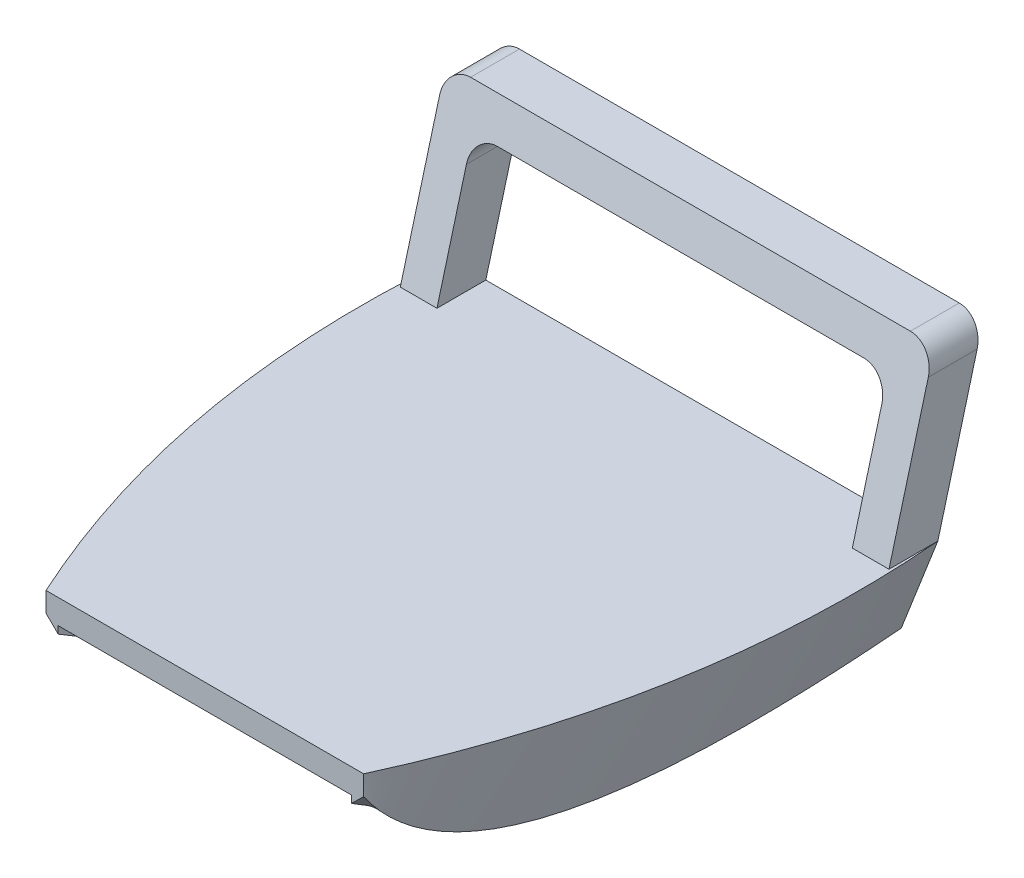
ISO-10303-21;
HEADER;
FILE_DESCRIPTION(('STEP AP214'),'2;1');
FILE_NAME('part.step','',(''),(''),'','','');
FILE_SCHEMA(('AUTOMOTIVE_DESIGN { 1 0 10303 214 1 1 1 1 }'));
ENDSEC;
DATA;
#1=APPLICATION_CONTEXT('core data for automotive mechanical design processes');
#2=APPLICATION_PROTOCOL_DEFINITION('international standard','automotive_design',2000,#1);
#3=PRODUCT_CONTEXT('',#1,'mechanical');
#4=PRODUCT('Part','Part','',(#3));
#5=PRODUCT_RELATED_PRODUCT_CATEGORY('part','',(#4));
#6=PRODUCT_DEFINITION_FORMATION('','',#4);
#7=PRODUCT_DEFINITION_CONTEXT('part definition',#1,'design');
#8=PRODUCT_DEFINITION('design','',#6,#7);
#9=PRODUCT_DEFINITION_SHAPE('','',#8);
#10=(LENGTH_UNIT() NAMED_UNIT(*) SI_UNIT(.MILLI.,.METRE.));
#11=(NAMED_UNIT(*) PLANE_ANGLE_UNIT() SI_UNIT($,.RADIAN.));
#12=(NAMED_UNIT(*) SI_UNIT($,.STERADIAN.) SOLID_ANGLE_UNIT());
#13=UNCERTAINTY_MEASURE_WITH_UNIT(LENGTH_MEASURE(1.E-05),#10,'distance_accuracy_value','');
#14=(GEOMETRIC_REPRESENTATION_CONTEXT(3) GLOBAL_UNCERTAINTY_ASSIGNED_CONTEXT((#13)) GLOBAL_UNIT_ASSIGNED_CONTEXT((#10,
#11,#12)) REPRESENTATION_CONTEXT('',''));
#15=CARTESIAN_POINT('',(0.,0.,0.));
#16=DIRECTION('',(0.,0.,1.));
#17=DIRECTION('',(1.,0.,0.));
#18=AXIS2_PLACEMENT_3D('',#15,#16,#17);
#19=CARTESIAN_POINT('',(1000.,700.,-187.609439102857));
#20=DIRECTION('',(0.,0.258876985011601,0.965910299474699));
#21=DIRECTION('',(0.,-0.965910299474699,0.258876985011601));
#22=AXIS2_PLACEMENT_3D('',#19,#20,#21);
#23=PLANE('',#22);
#24=DIRECTION('',(-1.,0.,0.));
#25=VECTOR('',#24,1.);
#26=CARTESIAN_POINT('',(1000.,700.,-187.609439102857));
#27=LINE('',#26,#25);
#28=CARTESIAN_POINT('',(900.,700.,-187.609439102857));
#29=VERTEX_POINT('',#28);
#30=CARTESIAN_POINT('',(-900.,700.,-187.609439102857));
#31=VERTEX_POINT('',#30);
#32=EDGE_CURVE('E278',#29,#31,#27,.T.);
#33=ORIENTED_EDGE('',*,*,#32,.F.);
#34=CARTESIAN_POINT('',(900.,600.,-160.808090659591));
#35=DIRECTION('',(0.,0.258876985011601,0.965910299474699));
#36=DIRECTION('',(0.,-0.965910299474699,0.258876985011601));
#37=AXIS2_PLACEMENT_3D('',#34,#35,#36);
#38=ELLIPSE('',#37,103.529282226708,100.);
#39=CARTESIAN_POINT('',(1000.,600.,-160.808090659591));
#40=VERTEX_POINT('',#39);
#41=EDGE_CURVE('E666',#29,#40,#38,.F.);
#42=ORIENTED_EDGE('',*,*,#41,.T.);
#43=DIRECTION('',(0.,0.965910299474699,-0.258876985011601));
#44=VECTOR('',#43,1.);
#45=CARTESIAN_POINT('',(1000.,700.,-187.609439102857));
#46=LINE('',#45,#44);
#47=CARTESIAN_POINT('',(1000.,0.,0.));
#48=VERTEX_POINT('',#47);
#49=EDGE_CURVE('E597',#48,#40,#46,.T.);
#50=ORIENTED_EDGE('',*,*,#49,.F.);
#51=DIRECTION('',(-1.,0.,0.));
#52=VECTOR('',#51,1.);
#53=CARTESIAN_POINT('',(0.,0.,0.));
#54=LINE('',#53,#52);
#55=CARTESIAN_POINT('',(850.,0.,0.));
#56=VERTEX_POINT('',#55);
#57=EDGE_CURVE('E424',#48,#56,#54,.T.);
#58=ORIENTED_EDGE('',*,*,#57,.T.);
#59=DIRECTION('',(0.,-0.965910299474699,0.258876985011601));
#60=VECTOR('',#59,1.);
#61=CARTESIAN_POINT('',(850.,700.,-187.609439102857));
#62=LINE('',#61,#60);
#63=CARTESIAN_POINT('',(850.,450.,-120.606067994694));
#64=VERTEX_POINT('',#63);
#65=EDGE_CURVE('E252',#64,#56,#62,.T.);
#66=ORIENTED_EDGE('',*,*,#65,.F.);
#67=CARTESIAN_POINT('',(750.,450.,-120.606067994693));
#68=DIRECTION('',(0.,0.258876985011601,0.965910299474699));
#69=DIRECTION('',(0.,-0.965910299474699,0.258876985011601));
#70=AXIS2_PLACEMENT_3D('',#67,#68,#69);
#71=ELLIPSE('',#70,103.529282226708,100.);
#72=CARTESIAN_POINT('',(750.,550.,-147.407416437959));
#73=VERTEX_POINT('',#72);
#74=EDGE_CURVE('E117',#64,#73,#71,.T.);
#75=ORIENTED_EDGE('',*,*,#74,.T.);
#76=DIRECTION('',(1.,0.,0.));
#77=VECTOR('',#76,1.);
#78=CARTESIAN_POINT('',(1000.,550.,-147.407416437959));
#79=LINE('',#78,#77);
#80=CARTESIAN_POINT('',(-750.,550.,-147.407416437959));
#81=VERTEX_POINT('',#80);
#82=EDGE_CURVE('E651',#81,#73,#79,.T.);
#83=ORIENTED_EDGE('',*,*,#82,.F.);
#84=CARTESIAN_POINT('',(-750.,450.,-120.606067994693));
#85=DIRECTION('',(0.,0.258876985011601,0.965910299474699));
#86=DIRECTION('',(0.,-0.965910299474699,0.258876985011601));
#87=AXIS2_PLACEMENT_3D('',#84,#85,#86);
#88=ELLIPSE('',#87,103.529282226708,100.);
#89=CARTESIAN_POINT('',(-850.,450.,-120.606067994694));
#90=VERTEX_POINT('',#89);
#91=EDGE_CURVE('E131',#81,#90,#88,.T.);
#92=ORIENTED_EDGE('',*,*,#91,.T.);
#93=DIRECTION('',(0.,0.965910299474699,-0.258876985011601));
#94=VECTOR('',#93,1.);
#95=CARTESIAN_POINT('',(-850.,700.,-187.609439102857));
#96=LINE('',#95,#94);
#97=CARTESIAN_POINT('',(-850.,0.,0.));
#98=VERTEX_POINT('',#97);
#99=EDGE_CURVE('E423',#98,#90,#96,.T.);
#100=ORIENTED_EDGE('',*,*,#99,.F.);
#101=DIRECTION('',(1.,0.,0.));
#102=VECTOR('',#101,1.);
#103=CARTESIAN_POINT('',(0.,0.,0.));
#104=LINE('',#103,#102);
#105=CARTESIAN_POINT('',(-1000.,0.,0.));
#106=VERTEX_POINT('',#105);
#107=EDGE_CURVE('E415',#106,#98,#104,.T.);
#108=ORIENTED_EDGE('',*,*,#107,.F.);
#109=DIRECTION('',(0.,0.965910299474699,-0.258876985011601));
#110=VECTOR('',#109,1.);
#111=CARTESIAN_POINT('',(-1000.,700.,-187.609439102857));
#112=LINE('',#111,#110);
#113=CARTESIAN_POINT('',(-1000.,600.,-160.808090659591));
#114=VERTEX_POINT('',#113);
#115=EDGE_CURVE('E629',#106,#114,#112,.T.);
#116=ORIENTED_EDGE('',*,*,#115,.T.);
#117=CARTESIAN_POINT('',(-900.,600.,-160.808090659591));
#118=DIRECTION('',(0.,0.258876985011601,0.965910299474699));
#119=DIRECTION('',(0.,0.965910299474699,-0.258876985011601));
#120=AXIS2_PLACEMENT_3D('',#117,#118,#119);
#121=ELLIPSE('',#120,103.529282226708,100.);
#122=EDGE_CURVE('E664',#114,#31,#121,.F.);
#123=ORIENTED_EDGE('',*,*,#122,.T.);
#124=EDGE_LOOP('',(#33,#42,#50,#58,#66,#75,#83,#92,#100,#108,#116,#123));
#125=FACE_BOUND('',#124,.T.);
#126=ADVANCED_FACE('F109',(#125),#23,.F.);
#127=CARTESIAN_POINT('',(1000.,0.,200.));
#128=DIRECTION('',(0.,-0.258876985011601,-0.965910299474699));
#129=DIRECTION('',(0.,0.965910299474699,-0.258876985011601));
#130=AXIS2_PLACEMENT_3D('',#127,#128,#129);
#131=PLANE('',#130);
#132=DIRECTION('',(0.,-0.965910299474699,0.258876985011601));
#133=VECTOR('',#132,1.);
#134=CARTESIAN_POINT('',(1000.,0.,200.));
#135=LINE('',#134,#133);
#136=CARTESIAN_POINT('',(1000.,600.,39.1919093404087));
#137=VERTEX_POINT('',#136);
#138=CARTESIAN_POINT('',(1000.,0.,200.));
#139=VERTEX_POINT('',#138);
#140=EDGE_CURVE('E281',#137,#139,#135,.T.);
#141=ORIENTED_EDGE('',*,*,#140,.F.);
#142=CARTESIAN_POINT('',(900.,600.,39.1919093404086));
#143=DIRECTION('',(0.,-0.258876985011601,-0.965910299474699));
#144=DIRECTION('',(0.,-0.965910299474699,0.258876985011601));
#145=AXIS2_PLACEMENT_3D('',#142,#143,#144);
#146=ELLIPSE('',#145,103.529282226708,100.);
#147=CARTESIAN_POINT('',(900.,700.,12.3905608971434));
#148=VERTEX_POINT('',#147);
#149=EDGE_CURVE('E710',#137,#148,#146,.F.);
#150=ORIENTED_EDGE('',*,*,#149,.T.);
#151=DIRECTION('',(-1.,0.,0.));
#152=VECTOR('',#151,1.);
#153=CARTESIAN_POINT('',(1000.,700.,12.3905608971434));
#154=LINE('',#153,#152);
#155=CARTESIAN_POINT('',(-900.,700.,12.3905608971434));
#156=VERTEX_POINT('',#155);
#157=EDGE_CURVE('E274',#148,#156,#154,.T.);
#158=ORIENTED_EDGE('',*,*,#157,.T.);
#159=CARTESIAN_POINT('',(-900.,600.,39.1919093404087));
#160=DIRECTION('',(0.,-0.258876985011601,-0.965910299474699));
#161=DIRECTION('',(0.,0.965910299474699,-0.258876985011601));
#162=AXIS2_PLACEMENT_3D('',#159,#160,#161);
#163=ELLIPSE('',#162,103.529282226708,100.);
#164=CARTESIAN_POINT('',(-1000.,600.,39.1919093404087));
#165=VERTEX_POINT('',#164);
#166=EDGE_CURVE('E712',#156,#165,#163,.F.);
#167=ORIENTED_EDGE('',*,*,#166,.T.);
#168=DIRECTION('',(0.,-0.965910299474699,0.258876985011601));
#169=VECTOR('',#168,1.);
#170=CARTESIAN_POINT('',(-1000.,0.,200.));
#171=LINE('',#170,#169);
#172=CARTESIAN_POINT('',(-1000.,0.,200.));
#173=VERTEX_POINT('',#172);
#174=EDGE_CURVE('E283',#165,#173,#171,.T.);
#175=ORIENTED_EDGE('',*,*,#174,.T.);
#176=DIRECTION('',(-1.,0.,0.));
#177=VECTOR('',#176,1.);
#178=CARTESIAN_POINT('',(1000.,0.,200.));
#179=LINE('',#178,#177);
#180=CARTESIAN_POINT('',(-850.,0.,200.));
#181=VERTEX_POINT('',#180);
#182=EDGE_CURVE('E275',#181,#173,#179,.T.);
#183=ORIENTED_EDGE('',*,*,#182,.F.);
#184=DIRECTION('',(0.,-0.965910299474699,0.258876985011601));
#185=VECTOR('',#184,1.);
#186=CARTESIAN_POINT('',(-850.,0.,200.));
#187=LINE('',#186,#185);
#188=CARTESIAN_POINT('',(-850.,450.,79.3939320053065));
#189=VERTEX_POINT('',#188);
#190=EDGE_CURVE('E266',#189,#181,#187,.T.);
#191=ORIENTED_EDGE('',*,*,#190,.F.);
#192=CARTESIAN_POINT('',(-750.,450.,79.3939320053065));
#193=DIRECTION('',(0.,-0.258876985011601,-0.965910299474699));
#194=DIRECTION('',(0.,-0.965910299474699,0.258876985011601));
#195=AXIS2_PLACEMENT_3D('',#192,#193,#194);
#196=ELLIPSE('',#195,103.529282226708,100.);
#197=CARTESIAN_POINT('',(-750.,550.,52.5925835620413));
#198=VERTEX_POINT('',#197);
#199=EDGE_CURVE('E679',#189,#198,#196,.T.);
#200=ORIENTED_EDGE('',*,*,#199,.T.);
#201=DIRECTION('',(-1.,0.,0.));
#202=VECTOR('',#201,1.);
#203=CARTESIAN_POINT('',(1000.,550.,52.5925835620413));
#204=LINE('',#203,#202);
#205=CARTESIAN_POINT('',(750.,550.,52.5925835620413));
#206=VERTEX_POINT('',#205);
#207=EDGE_CURVE('E267',#206,#198,#204,.T.);
#208=ORIENTED_EDGE('',*,*,#207,.F.);
#209=CARTESIAN_POINT('',(750.,450.,79.3939320053065));
#210=DIRECTION('',(0.,-0.258876985011601,-0.965910299474699));
#211=DIRECTION('',(0.,-0.965910299474699,0.258876985011601));
#212=AXIS2_PLACEMENT_3D('',#209,#210,#211);
#213=ELLIPSE('',#212,103.529282226708,100.);
#214=CARTESIAN_POINT('',(850.,450.,79.3939320053065));
#215=VERTEX_POINT('',#214);
#216=EDGE_CURVE('E13',#206,#215,#213,.T.);
#217=ORIENTED_EDGE('',*,*,#216,.T.);
#218=DIRECTION('',(0.,0.965910299474699,-0.258876985011601));
#219=VECTOR('',#218,1.);
#220=CARTESIAN_POINT('',(850.,0.,200.));
#221=LINE('',#220,#219);
#222=CARTESIAN_POINT('',(850.,0.,200.));
#223=VERTEX_POINT('',#222);
#224=EDGE_CURVE('E250',#223,#215,#221,.T.);
#225=ORIENTED_EDGE('',*,*,#224,.F.);
#226=EDGE_CURVE('E262',#139,#223,#179,.T.);
#227=ORIENTED_EDGE('',*,*,#226,.F.);
#228=EDGE_LOOP('',(#141,#150,#158,#167,#175,#183,#191,#200,#208,#217,#225,#227));
#229=FACE_BOUND('',#228,.T.);
#230=ADVANCED_FACE('F261',(#229),#131,.F.);
#231=CARTESIAN_POINT('',(956.26787772273,0.,1021.52801923705));
#232=DIRECTION('',(0.,1.,0.));
#233=DIRECTION('',(0.,0.,1.));
#234=AXIS2_PLACEMENT_3D('',#231,#232,#233);
#235=PLANE('',#234);
#236=DIRECTION('',(0.,0.,-1.));
#237=VECTOR('',#236,1.);
#238=CARTESIAN_POINT('',(-850.,0.,2000.05));
#239=LINE('',#238,#237);
#240=EDGE_CURVE('E256',#181,#98,#239,.T.);
#241=ORIENTED_EDGE('',*,*,#240,.F.);
#242=ORIENTED_EDGE('',*,*,#182,.T.);
#243=DIRECTION('',(0.,0.,-1.));
#244=VECTOR('',#243,1.);
#245=CARTESIAN_POINT('',(-1000.,0.,0.));
#246=LINE('',#245,#244);
#247=EDGE_CURVE('E636',#173,#106,#246,.T.);
#248=ORIENTED_EDGE('',*,*,#247,.T.);
#249=CARTESIAN_POINT('',(-650.000000000001,-9.9513098510631E-12,2000.));
#250=CARTESIAN_POINT('',(-941.690503630308,-1.4417006131429E-11,1362.03735898273));
#251=CARTESIAN_POINT('',(-1058.35717029697,-1.62031386687993E-11,695.370692316063));
#252=CARTESIAN_POINT('',(-1000.,-1.5087662858249E-11,-5.13660575880198E-13));
#253=B_SPLINE_CURVE_WITH_KNOTS('',3,(#249,#250,#251,#252),.UNSPECIFIED.,.F.,.F.,(4,4),(0.,1.),.UNSPECIFIED.);
#254=CARTESIAN_POINT('',(-650.000000000001,-9.9513098510631E-12,2000.));
#255=VERTEX_POINT('',#254);
#256=EDGE_CURVE('E519',#106,#255,#253,.F.);
#257=ORIENTED_EDGE('',*,*,#256,.T.);
#258=DIRECTION('',(-1.,0.,0.));
#259=VECTOR('',#258,1.);
#260=CARTESIAN_POINT('',(0.,0.,2000.));
#261=LINE('',#260,#259);
#262=CARTESIAN_POINT('',(650.,0.,2000.));
#263=VERTEX_POINT('',#262);
#264=EDGE_CURVE('E419',#263,#255,#261,.T.);
#265=ORIENTED_EDGE('',*,*,#264,.F.);
#266=CARTESIAN_POINT('',(1000.,2.22044604925031E-13,0.));
#267=CARTESIAN_POINT('',(1058.35717029697,0.,695.370692316063));
#268=CARTESIAN_POINT('',(941.690503630307,0.,1362.03735898273));
#269=CARTESIAN_POINT('',(650.,0.,2000.));
#270=B_SPLINE_CURVE_WITH_KNOTS('',3,(#266,#267,#268,#269),.UNSPECIFIED.,.F.,.F.,(4,4),(0.,1.),.UNSPECIFIED.);
#271=EDGE_CURVE('E785',#48,#263,#270,.T.);
#272=ORIENTED_EDGE('',*,*,#271,.F.);
#273=DIRECTION('',(0.,0.,-1.));
#274=VECTOR('',#273,1.);
#275=CARTESIAN_POINT('',(1000.,0.,0.));
#276=LINE('',#275,#274);
#277=EDGE_CURVE('E273',#139,#48,#276,.T.);
#278=ORIENTED_EDGE('',*,*,#277,.F.);
#279=ORIENTED_EDGE('',*,*,#226,.T.);
#280=DIRECTION('',(0.,0.,-1.));
#281=VECTOR('',#280,1.);
#282=CARTESIAN_POINT('',(850.,0.,2000.05));
#283=LINE('',#282,#281);
#284=EDGE_CURVE('E246',#223,#56,#283,.T.);
#285=ORIENTED_EDGE('',*,*,#284,.T.);
#286=EDGE_CURVE('E420',#56,#98,#54,.T.);
#287=ORIENTED_EDGE('',*,*,#286,.T.);
#288=EDGE_LOOP('',(#241,#242,#248,#257,#265,#272,#278,#279,#285,#287));
#289=FACE_BOUND('',#288,.T.);
#290=ADVANCED_FACE('F270',(#289),#235,.T.);
#291=CARTESIAN_POINT('',(0.,0.,2000.));
#292=DIRECTION('',(0.,0.,-1.));
#293=DIRECTION('',(-1.,0.,0.));
#294=AXIS2_PLACEMENT_3D('',#291,#292,#293);
#295=PLANE('',#294);
#296=ORIENTED_EDGE('',*,*,#264,.T.);
#297=DIRECTION('',(0.,1.,0.));
#298=VECTOR('',#297,1.);
#299=CARTESIAN_POINT('',(-650.000000000001,-9.9513098510631E-12,2000.));
#300=LINE('',#299,#298);
#301=CARTESIAN_POINT('',(-650.,-81.0102051443464,2000.));
#302=VERTEX_POINT('',#301);
#303=EDGE_CURVE('E288',#302,#255,#300,.T.);
#304=ORIENTED_EDGE('',*,*,#303,.F.);
#305=DIRECTION('',(-0.714285714285726,0.699854212223754,0.));
#306=VECTOR('',#305,1.);
#307=CARTESIAN_POINT('',(-650.,-81.0102051443464,2000.));
#308=LINE('',#307,#306);
#309=CARTESIAN_POINT('',(-599.999999999999,-130.000000000009,2000.));
#310=VERTEX_POINT('',#309);
#311=EDGE_CURVE('E827',#310,#302,#308,.T.);
#312=ORIENTED_EDGE('',*,*,#311,.F.);
#313=DIRECTION('',(0.,-1.,0.));
#314=VECTOR('',#313,1.);
#315=CARTESIAN_POINT('',(-599.999999999999,-130.000000000009,2000.));
#316=LINE('',#315,#314);
#317=CARTESIAN_POINT('',(-599.999999999999,-100.000000000009,2000.));
#318=VERTEX_POINT('',#317);
#319=EDGE_CURVE('E829',#318,#310,#316,.T.);
#320=ORIENTED_EDGE('',*,*,#319,.F.);
#321=DIRECTION('',(-1.,0.,0.));
#322=VECTOR('',#321,1.);
#323=CARTESIAN_POINT('',(-599.999999999999,-100.000000000009,2000.));
#324=LINE('',#323,#322);
#325=CARTESIAN_POINT('',(0.,-100.,2000.));
#326=VERTEX_POINT('',#325);
#327=EDGE_CURVE('E355',#326,#318,#324,.T.);
#328=ORIENTED_EDGE('',*,*,#327,.F.);
#329=DIRECTION('',(1.,0.,0.));
#330=VECTOR('',#329,1.);
#331=CARTESIAN_POINT('',(600.,-99.9999999999999,2000.));
#332=LINE('',#331,#330);
#333=CARTESIAN_POINT('',(600.,-99.9999999999999,2000.));
#334=VERTEX_POINT('',#333);
#335=EDGE_CURVE('E847',#326,#334,#332,.T.);
#336=ORIENTED_EDGE('',*,*,#335,.T.);
#337=DIRECTION('',(0.,-1.,0.));
#338=VECTOR('',#337,1.);
#339=CARTESIAN_POINT('',(600.,-130.,2000.));
#340=LINE('',#339,#338);
#341=CARTESIAN_POINT('',(600.,-130.,2000.));
#342=VERTEX_POINT('',#341);
#343=EDGE_CURVE('E849',#334,#342,#340,.T.);
#344=ORIENTED_EDGE('',*,*,#343,.T.);
#345=DIRECTION('',(0.714285714285715,0.699854212223765,0.));
#346=VECTOR('',#345,1.);
#347=CARTESIAN_POINT('',(650.,-81.0102051443364,2000.));
#348=LINE('',#347,#346);
#349=CARTESIAN_POINT('',(650.,-81.0102051443364,2000.));
#350=VERTEX_POINT('',#349);
#351=EDGE_CURVE('E863',#342,#350,#348,.T.);
#352=ORIENTED_EDGE('',*,*,#351,.T.);
#353=DIRECTION('',(0.,1.,0.));
#354=VECTOR('',#353,1.);
#355=CARTESIAN_POINT('',(650.,0.,2000.));
#356=LINE('',#355,#354);
#357=EDGE_CURVE('E989',#350,#263,#356,.T.);
#358=ORIENTED_EDGE('',*,*,#357,.T.);
#359=EDGE_LOOP('',(#296,#304,#312,#320,#328,#336,#344,#352,#358));
#360=FACE_BOUND('',#359,.T.);
#361=ADVANCED_FACE('F454',(#360),#295,.F.);
#362=CARTESIAN_POINT('',(0.,0.,0.));
#363=DIRECTION('',(0.,0.,1.));
#364=DIRECTION('',(1.,0.,0.));
#365=AXIS2_PLACEMENT_3D('',#362,#363,#364);
#366=PLANE('',#365);
#367=DIRECTION('',(1.,0.,0.));
#368=VECTOR('',#367,1.);
#369=CARTESIAN_POINT('',(0.,-400.,0.));
#370=LINE('',#369,#368);
#371=CARTESIAN_POINT('',(6.0748971133037E-12,-400.,0.));
#372=VERTEX_POINT('',#371);
#373=CARTESIAN_POINT('',(600.,-400.,0.));
#374=VERTEX_POINT('',#373);
#375=EDGE_CURVE('E776',#372,#374,#370,.T.);
#376=ORIENTED_EDGE('',*,*,#375,.F.);
#377=DIRECTION('',(-1.,0.,0.));
#378=VECTOR('',#377,1.);
#379=CARTESIAN_POINT('',(6.0748971133037E-12,-400.,0.));
#380=LINE('',#379,#378);
#381=CARTESIAN_POINT('',(-599.999999999994,-400.000000000009,-3.08196345528117E-13));
#382=VERTEX_POINT('',#381);
#383=EDGE_CURVE('E778',#372,#382,#380,.T.);
#384=ORIENTED_EDGE('',*,*,#383,.T.);
#385=DIRECTION('',(0.,-1.,0.));
#386=VECTOR('',#385,1.);
#387=CARTESIAN_POINT('',(-599.999999999994,-400.000000000009,-3.08196345528117E-13));
#388=LINE('',#387,#386);
#389=CARTESIAN_POINT('',(-599.999999999991,-550.000000000009,-3.08196345528116E-13));
#390=VERTEX_POINT('',#389);
#391=EDGE_CURVE('E792',#382,#390,#388,.T.);
#392=ORIENTED_EDGE('',*,*,#391,.T.);
#393=DIRECTION('',(-0.833333333333342,0.552770798392553,0.));
#394=VECTOR('',#393,1.);
#395=CARTESIAN_POINT('',(-599.999999999991,-550.000000000009,-3.08196345528116E-13));
#396=LINE('',#395,#394);
#397=CARTESIAN_POINT('',(-849.999999999994,-384.168760482243,-4.36611489498167E-13));
#398=VERTEX_POINT('',#397);
#399=EDGE_CURVE('E342',#390,#398,#396,.T.);
#400=ORIENTED_EDGE('',*,*,#399,.T.);
#401=DIRECTION('',(-0.363711840205884,0.931511512163994,0.));
#402=VECTOR('',#401,1.);
#403=CARTESIAN_POINT('',(-849.999999999994,-384.168760482243,-4.36611489498167E-13));
#404=LINE('',#403,#402);
#405=EDGE_CURVE('E368',#398,#106,#404,.T.);
#406=ORIENTED_EDGE('',*,*,#405,.T.);
#407=ORIENTED_EDGE('',*,*,#107,.T.);
#408=ORIENTED_EDGE('',*,*,#286,.F.);
#409=ORIENTED_EDGE('',*,*,#57,.F.);
#410=DIRECTION('',(0.363711840205869,0.931511512163999,0.));
#411=VECTOR('',#410,1.);
#412=CARTESIAN_POINT('',(850.,-384.16876048223,0.));
#413=LINE('',#412,#411);
#414=CARTESIAN_POINT('',(850.,-384.16876048223,0.));
#415=VERTEX_POINT('',#414);
#416=EDGE_CURVE('E610',#415,#48,#413,.T.);
#417=ORIENTED_EDGE('',*,*,#416,.F.);
#418=DIRECTION('',(0.833333333333334,0.552770798392566,0.));
#419=VECTOR('',#418,1.);
#420=CARTESIAN_POINT('',(600.,-550.,0.));
#421=LINE('',#420,#419);
#422=CARTESIAN_POINT('',(600.,-550.,0.));
#423=VERTEX_POINT('',#422);
#424=EDGE_CURVE('E612',#423,#415,#421,.T.);
#425=ORIENTED_EDGE('',*,*,#424,.F.);
#426=DIRECTION('',(0.,-1.,0.));
#427=VECTOR('',#426,1.);
#428=CARTESIAN_POINT('',(600.,-400.,0.));
#429=LINE('',#428,#427);
#430=EDGE_CURVE('E780',#374,#423,#429,.T.);
#431=ORIENTED_EDGE('',*,*,#430,.F.);
#432=EDGE_LOOP('',(#376,#384,#392,#400,#406,#407,#408,#409,#417,#425,#431));
#433=FACE_BOUND('',#432,.T.);
#434=ADVANCED_FACE('F444',(#433),#366,.F.);
#435=CARTESIAN_POINT('',(850.,-384.16876048223,0.));
#436=CARTESIAN_POINT('',(980.339016832515,-309.012688308536,816.014591568673));
#437=CARTESIAN_POINT('',(697.409129067556,-620.180744747319,1639.14845815006));
#438=CARTESIAN_POINT('',(650.,-81.0102051443364,2000.));
#439=CARTESIAN_POINT('',(900.,-256.112506988153,0.));
#440=CARTESIAN_POINT('',(1006.34506798733,-206.008458872358,775.79995848447));
#441=CARTESIAN_POINT('',(778.836253921806,-413.453829831546,1546.77809176095));
#442=CARTESIAN_POINT('',(650.,-54.0068034295576,2000.));
#443=CARTESIAN_POINT('',(950.,-128.056253494077,0.));
#444=CARTESIAN_POINT('',(1032.35111914215,-103.004229436179,735.585325400266));
#445=CARTESIAN_POINT('',(860.263378776057,-206.726914915773,1454.40772537184));
#446=CARTESIAN_POINT('',(650.,-27.0034017147788,2000.));
#447=CARTESIAN_POINT('',(1000.,2.22044604925031E-13,0.));
#448=CARTESIAN_POINT('',(1058.35717029697,0.,695.370692316063));
#449=CARTESIAN_POINT('',(941.690503630307,0.,1362.03735898273));
#450=CARTESIAN_POINT('',(650.,0.,2000.));
#451=B_SPLINE_SURFACE_WITH_KNOTS('',3,3,((#435,#436,#437,#438),(#439,#440,#441,#442),(#443,#444,
#445,#446),(#447,#448,#449,#450)),.UNSPECIFIED.,.F.,.F.,.F.,(4,4),(4,4),(0.,1.),(0.,1.),.UNSPECIFIED.);
#452=CARTESIAN_POINT('',(850.,-384.16876048223,0.));
#453=CARTESIAN_POINT('',(980.339016832515,-309.012688308536,816.014591568673));
#454=CARTESIAN_POINT('',(697.409129067556,-620.180744747319,1639.14845815006));
#455=CARTESIAN_POINT('',(650.,-81.0102051443364,2000.));
#456=B_SPLINE_CURVE_WITH_KNOTS('',3,(#452,#453,#454,#455),.UNSPECIFIED.,.F.,.F.,(4,4),(0.,1.),.UNSPECIFIED.);
#457=EDGE_CURVE('E848',#415,#350,#456,.T.);
#458=ORIENTED_EDGE('',*,*,#416,.T.);
#459=ORIENTED_EDGE('',*,*,#271,.T.);
#460=ORIENTED_EDGE('',*,*,#357,.F.);
#461=ORIENTED_EDGE('',*,*,#457,.F.);
#462=EDGE_LOOP('',(#458,#459,#460,#461));
#463=FACE_BOUND('',#462,.T.);
#464=ADVANCED_FACE('F453',(#463),#451,.T.);
#465=CARTESIAN_POINT('',(0.,-400.,0.));
#466=CARTESIAN_POINT('',(-3.62513666241704E-13,-367.021070822676,619.283108727068));
#467=CARTESIAN_POINT('',(6.67966331851414E-13,-529.66556137813,1454.61989504646));
#468=CARTESIAN_POINT('',(0.,-100.,2000.));
#469=CARTESIAN_POINT('',(200.,-400.,0.));
#470=CARTESIAN_POINT('',(200.,-367.021070822676,619.283108727068));
#471=CARTESIAN_POINT('',(200.000000000001,-529.66556137813,1454.61989504646));
#472=CARTESIAN_POINT('',(200.,-100.,2000.));
#473=CARTESIAN_POINT('',(400.,-400.,0.));
#474=CARTESIAN_POINT('',(400.,-367.021070822675,619.283108727068));
#475=CARTESIAN_POINT('',(400.,-529.66556137813,1454.61989504646));
#476=CARTESIAN_POINT('',(400.,-100.,2000.));
#477=CARTESIAN_POINT('',(600.,-400.,0.));
#478=CARTESIAN_POINT('',(600.,-367.021070822675,619.283108727067));
#479=CARTESIAN_POINT('',(600.,-529.66556137813,1454.61989504646));
#480=CARTESIAN_POINT('',(600.,-99.9999999999999,2000.));
#481=B_SPLINE_SURFACE_WITH_KNOTS('',3,3,((#465,#466,#467,#468),(#469,#470,#471,#472),(#473,#474,
#475,#476),(#477,#478,#479,#480)),.UNSPECIFIED.,.F.,.F.,.F.,(4,4),(4,4),(0.,1.),(0.,1.),.UNSPECIFIED.);
#482=CARTESIAN_POINT('',(600.,-400.,0.));
#483=CARTESIAN_POINT('',(600.,-367.021070822675,619.283108727067));
#484=CARTESIAN_POINT('',(600.,-529.66556137813,1454.61989504646));
#485=CARTESIAN_POINT('',(600.,-99.9999999999999,2000.));
#486=B_SPLINE_CURVE_WITH_KNOTS('',3,(#482,#483,#484,#485),.UNSPECIFIED.,.F.,.F.,(4,4),(0.,1.),.UNSPECIFIED.);
#487=EDGE_CURVE('E858',#374,#334,#486,.T.);
#488=CARTESIAN_POINT('',(0.,-100.,2000.));
#489=CARTESIAN_POINT('',(6.67966331851414E-13,-529.66556137813,1454.61989504646));
#490=CARTESIAN_POINT('',(-3.62513666241704E-13,-367.021070822676,619.283108727068));
#491=CARTESIAN_POINT('',(0.,-400.,0.));
#492=B_SPLINE_CURVE_WITH_KNOTS('',3,(#488,#489,#490,#491),.UNSPECIFIED.,.F.,.F.,(4,4),(0.,1.),.UNSPECIFIED.);
#493=EDGE_CURVE('E790',#326,#372,#492,.T.);
#494=ORIENTED_EDGE('',*,*,#375,.T.);
#495=ORIENTED_EDGE('',*,*,#487,.T.);
#496=ORIENTED_EDGE('',*,*,#335,.F.);
#497=ORIENTED_EDGE('',*,*,#493,.T.);
#498=EDGE_LOOP('',(#494,#495,#496,#497));
#499=FACE_BOUND('',#498,.T.);
#500=ADVANCED_FACE('F868',(#499),#481,.T.);
#501=CARTESIAN_POINT('',(600.,-520.003469305222,1040.81689833622));
#502=DIRECTION('',(1.,0.,0.));
#503=DIRECTION('',(0.,1.,0.));
#504=AXIS2_PLACEMENT_3D('',#501,#502,#503);
#505=PLANE('',#504);
#506=CARTESIAN_POINT('',(600.,-130.,2000.));
#507=CARTESIAN_POINT('',(600.,-510.004625740297,1387.75586444829));
#508=CARTESIAN_POINT('',(600.,-650.004625740297,721.089197781621));
#509=CARTESIAN_POINT('',(600.,-550.,0.));
#510=B_SPLINE_CURVE_WITH_KNOTS('',3,(#506,#507,#508,#509),.UNSPECIFIED.,.F.,.F.,(4,4),(0.,1.),.UNSPECIFIED.);
#511=EDGE_CURVE('E861',#342,#423,#510,.T.);
#512=ORIENTED_EDGE('',*,*,#511,.F.);
#513=ORIENTED_EDGE('',*,*,#343,.F.);
#514=ORIENTED_EDGE('',*,*,#487,.F.);
#515=ORIENTED_EDGE('',*,*,#430,.T.);
#516=EDGE_LOOP('',(#512,#513,#514,#515));
#517=FACE_BOUND('',#516,.T.);
#518=ADVANCED_FACE('F857',(#517),#505,.F.);
#519=CARTESIAN_POINT('',(600.,-550.,0.));
#520=CARTESIAN_POINT('',(600.,-650.004625740297,721.089197781621));
#521=CARTESIAN_POINT('',(600.,-510.004625740297,1387.75586444829));
#522=CARTESIAN_POINT('',(600.,-130.,2000.));
#523=CARTESIAN_POINT('',(683.333333333333,-494.722920160743,0.));
#524=CARTESIAN_POINT('',(726.779672277505,-536.340646596377,752.730995710638));
#525=CARTESIAN_POINT('',(632.469709689185,-546.729998742637,1471.55339568221));
#526=CARTESIAN_POINT('',(616.666666666667,-113.670068381445,2000.));
#527=CARTESIAN_POINT('',(766.666666666667,-439.445840321487,0.));
#528=CARTESIAN_POINT('',(853.55934455501,-422.676667452457,784.372793639656));
#529=CARTESIAN_POINT('',(664.93941937837,-583.455371744978,1555.35092691614));
#530=CARTESIAN_POINT('',(633.333333333333,-97.3401367628909,2000.));
#531=CARTESIAN_POINT('',(850.,-384.16876048223,0.));
#532=CARTESIAN_POINT('',(980.339016832515,-309.012688308536,816.014591568673));
#533=CARTESIAN_POINT('',(697.409129067556,-620.180744747319,1639.14845815006));
#534=CARTESIAN_POINT('',(650.,-81.0102051443364,2000.));
#535=B_SPLINE_SURFACE_WITH_KNOTS('',3,3,((#519,#520,#521,#522),(#523,#524,#525,#526),(#527,#528,
#529,#530),(#531,#532,#533,#534)),.UNSPECIFIED.,.F.,.F.,.F.,(4,4),(4,4),(0.,1.),(0.,1.),.UNSPECIFIED.);
#536=ORIENTED_EDGE('',*,*,#424,.T.);
#537=ORIENTED_EDGE('',*,*,#457,.T.);
#538=ORIENTED_EDGE('',*,*,#351,.F.);
#539=ORIENTED_EDGE('',*,*,#511,.T.);
#540=EDGE_LOOP('',(#536,#537,#538,#539));
#541=FACE_BOUND('',#540,.T.);
#542=ADVANCED_FACE('F384',(#541),#535,.T.);
#543=CARTESIAN_POINT('',(-849.999999999994,-384.168760482243,-4.36611489498167E-13));
#544=CARTESIAN_POINT('',(-980.33901683251,-309.012688308551,816.014591568672));
#545=CARTESIAN_POINT('',(-697.409129067547,-620.18074474733,1639.14845815006));
#546=CARTESIAN_POINT('',(-650.,-81.0102051443464,2000.));
#547=CARTESIAN_POINT('',(-899.999999999996,-256.112506988167,-4.62294518292177E-13));
#548=CARTESIAN_POINT('',(-1006.34506798733,-206.008458872373,775.799958484469));
#549=CARTESIAN_POINT('',(-778.836253921801,-413.453829831558,1546.77809176095));
#550=CARTESIAN_POINT('',(-650.,-54.0068034295676,2000.));
#551=CARTESIAN_POINT('',(-949.999999999998,-128.056253494091,-4.87977547086187E-13));
#552=CARTESIAN_POINT('',(-1032.35111914215,-103.004229436195,735.585325400266));
#553=CARTESIAN_POINT('',(-860.263378776054,-206.726914915786,1454.40772537184));
#554=CARTESIAN_POINT('',(-650.000000000001,-27.0034017147888,2000.));
#555=CARTESIAN_POINT('',(-1000.,-1.5087662858249E-11,-5.13660575880198E-13));
#556=CARTESIAN_POINT('',(-1058.35717029697,-1.62031386687993E-11,695.370692316063));
#557=CARTESIAN_POINT('',(-941.690503630308,-1.4417006131429E-11,1362.03735898273));
#558=CARTESIAN_POINT('',(-650.000000000001,-9.9513098510631E-12,2000.));
#559=B_SPLINE_SURFACE_WITH_KNOTS('',3,3,((#543,#544,#545,#546),(#547,#548,#549,#550),(#551,#552,
#553,#554),(#555,#556,#557,#558)),.UNSPECIFIED.,.F.,.F.,.F.,(4,4),(4,4),(0.,1.),(0.,1.),.UNSPECIFIED.);
#560=CARTESIAN_POINT('',(-849.999999999994,-384.168760482243,-4.36611489498167E-13));
#561=CARTESIAN_POINT('',(-980.33901683251,-309.012688308551,816.014591568672));
#562=CARTESIAN_POINT('',(-697.409129067547,-620.18074474733,1639.14845815006));
#563=CARTESIAN_POINT('',(-650.,-81.0102051443464,2000.));
#564=B_SPLINE_CURVE_WITH_KNOTS('',3,(#560,#561,#562,#563),.UNSPECIFIED.,.F.,.F.,(4,4),(0.,1.),.UNSPECIFIED.);
#565=EDGE_CURVE('E347',#398,#302,#564,.T.);
#566=ORIENTED_EDGE('',*,*,#405,.F.);
#567=ORIENTED_EDGE('',*,*,#565,.T.);
#568=ORIENTED_EDGE('',*,*,#303,.T.);
#569=ORIENTED_EDGE('',*,*,#256,.F.);
#570=EDGE_LOOP('',(#566,#567,#568,#569));
#571=FACE_BOUND('',#570,.T.);
#572=ADVANCED_FACE('F373',(#571),#559,.F.);
#573=CARTESIAN_POINT('',(6.0748971133037E-12,-400.,0.));
#574=CARTESIAN_POINT('',(5.66339757509611E-12,-367.021070822676,619.283108727068));
#575=CARTESIAN_POINT('',(6.69387757318922E-12,-529.66556137813,1454.61989504646));
#576=CARTESIAN_POINT('',(5.03649594557004E-13,-100.,2000.));
#577=CARTESIAN_POINT('',(-199.999999999994,-400.000000000003,-1.02732115176038E-13));
#578=CARTESIAN_POINT('',(-199.999999999994,-367.021070822679,619.283108727068));
#579=CARTESIAN_POINT('',(-199.999999999993,-529.665561378133,1454.61989504646));
#580=CARTESIAN_POINT('',(-199.999999999999,-100.000000000003,2000.));
#581=CARTESIAN_POINT('',(-399.999999999994,-400.000000000006,-2.05464230352077E-13));
#582=CARTESIAN_POINT('',(-399.999999999994,-367.021070822682,619.283108727067));
#583=CARTESIAN_POINT('',(-399.999999999993,-529.665561378136,1454.61989504646));
#584=CARTESIAN_POINT('',(-399.999999999999,-100.000000000006,2000.));
#585=CARTESIAN_POINT('',(-599.999999999994,-400.000000000009,-3.08196345528117E-13));
#586=CARTESIAN_POINT('',(-599.999999999994,-367.021070822685,619.283108727067));
#587=CARTESIAN_POINT('',(-599.999999999993,-529.665561378139,1454.61989504646));
#588=CARTESIAN_POINT('',(-599.999999999999,-100.000000000009,2000.));
#589=B_SPLINE_SURFACE_WITH_KNOTS('',3,3,((#573,#574,#575,#576),(#577,#578,#579,#580),(#581,#582,
#583,#584),(#585,#586,#587,#588)),.UNSPECIFIED.,.F.,.F.,.F.,(4,4),(4,4),(0.,1.),(0.,1.),.UNSPECIFIED.);
#590=CARTESIAN_POINT('',(-599.999999999999,-100.000000000009,2000.));
#591=CARTESIAN_POINT('',(-599.999999999993,-529.665561378139,1454.61989504646));
#592=CARTESIAN_POINT('',(-599.999999999994,-367.021070822685,619.283108727067));
#593=CARTESIAN_POINT('',(-599.999999999994,-400.000000000009,-3.08196345528117E-13));
#594=B_SPLINE_CURVE_WITH_KNOTS('',3,(#590,#591,#592,#593),.UNSPECIFIED.,.F.,.F.,(4,4),(0.,1.),.UNSPECIFIED.);
#595=EDGE_CURVE('E293',#382,#318,#594,.F.);
#596=ORIENTED_EDGE('',*,*,#383,.F.);
#597=ORIENTED_EDGE('',*,*,#493,.F.);
#598=ORIENTED_EDGE('',*,*,#327,.T.);
#599=ORIENTED_EDGE('',*,*,#595,.F.);
#600=EDGE_LOOP('',(#596,#597,#598,#599));
#601=FACE_BOUND('',#600,.T.);
#602=ADVANCED_FACE('F311',(#601),#589,.F.);
#603=CARTESIAN_POINT('',(-599.999999999992,-520.003469305232,1040.81689833622));
#604=DIRECTION('',(-1.,0.,0.));
#605=DIRECTION('',(0.,1.,0.));
#606=AXIS2_PLACEMENT_3D('',#603,#604,#605);
#607=PLANE('',#606);
#608=CARTESIAN_POINT('',(-599.999999999991,-550.000000000009,-3.08196345528116E-13));
#609=CARTESIAN_POINT('',(-599.99999999999,-650.004625740306,721.089197781621));
#610=CARTESIAN_POINT('',(-599.999999999992,-510.004625740306,1387.75586444829));
#611=CARTESIAN_POINT('',(-599.999999999999,-130.000000000009,2000.));
#612=B_SPLINE_CURVE_WITH_KNOTS('',3,(#608,#609,#610,#611),.UNSPECIFIED.,.F.,.F.,(4,4),(0.,1.),.UNSPECIFIED.);
#613=EDGE_CURVE('E354',#310,#390,#612,.F.);
#614=ORIENTED_EDGE('',*,*,#613,.T.);
#615=ORIENTED_EDGE('',*,*,#391,.F.);
#616=ORIENTED_EDGE('',*,*,#595,.T.);
#617=ORIENTED_EDGE('',*,*,#319,.T.);
#618=EDGE_LOOP('',(#614,#615,#616,#617));
#619=FACE_BOUND('',#618,.T.);
#620=ADVANCED_FACE('F300',(#619),#607,.F.);
#621=CARTESIAN_POINT('',(-599.999999999991,-550.000000000009,-3.08196345528116E-13));
#622=CARTESIAN_POINT('',(-599.99999999999,-650.004625740306,721.089197781621));
#623=CARTESIAN_POINT('',(-599.999999999992,-510.004625740306,1387.75586444829));
#624=CARTESIAN_POINT('',(-599.999999999999,-130.000000000009,2000.));
#625=CARTESIAN_POINT('',(-683.333333333326,-494.722920160754,-3.51001393518133E-13));
#626=CARTESIAN_POINT('',(-726.779672277497,-536.340646596388,752.730995710638));
#627=CARTESIAN_POINT('',(-632.469709689177,-546.729998742647,1471.55339568221));
#628=CARTESIAN_POINT('',(-616.666666666666,-113.670068381455,2000.));
#629=CARTESIAN_POINT('',(-766.66666666666,-439.445840321499,-3.9380644150815E-13));
#630=CARTESIAN_POINT('',(-853.559344555004,-422.67666745247,784.372793639655));
#631=CARTESIAN_POINT('',(-664.939419378362,-583.455371744989,1555.35092691614));
#632=CARTESIAN_POINT('',(-633.333333333333,-97.3401367629006,2000.));
#633=CARTESIAN_POINT('',(-849.999999999994,-384.168760482243,-4.36611489498167E-13));
#634=CARTESIAN_POINT('',(-980.33901683251,-309.012688308551,816.014591568672));
#635=CARTESIAN_POINT('',(-697.409129067547,-620.18074474733,1639.14845815006));
#636=CARTESIAN_POINT('',(-650.,-81.0102051443464,2000.));
#637=B_SPLINE_SURFACE_WITH_KNOTS('',3,3,((#621,#622,#623,#624),(#625,#626,#627,#628),(#629,#630,
#631,#632),(#633,#634,#635,#636)),.UNSPECIFIED.,.F.,.F.,.F.,(4,4),(4,4),(0.,1.),(0.,1.),.UNSPECIFIED.);
#638=ORIENTED_EDGE('',*,*,#399,.F.);
#639=ORIENTED_EDGE('',*,*,#613,.F.);
#640=ORIENTED_EDGE('',*,*,#311,.T.);
#641=ORIENTED_EDGE('',*,*,#565,.F.);
#642=EDGE_LOOP('',(#638,#639,#640,#641));
#643=FACE_BOUND('',#642,.T.);
#644=ADVANCED_FACE('F310',(#643),#637,.F.);
#645=CARTESIAN_POINT('',(1000.,700.,12.3905608971434));
#646=DIRECTION('',(0.,-1.,0.));
#647=DIRECTION('',(0.,0.,-1.));
#648=AXIS2_PLACEMENT_3D('',#645,#646,#647);
#649=PLANE('',#648);
#650=ORIENTED_EDGE('',*,*,#157,.F.);
#651=DIRECTION('',(0.,0.,1.));
#652=VECTOR('',#651,1.);
#653=CARTESIAN_POINT('',(900.,700.,12.3905608971434));
#654=LINE('',#653,#652);
#655=EDGE_CURVE('E662',#148,#29,#654,.F.);
#656=ORIENTED_EDGE('',*,*,#655,.T.);
#657=ORIENTED_EDGE('',*,*,#32,.T.);
#658=DIRECTION('',(0.,0.,1.));
#659=VECTOR('',#658,1.);
#660=CARTESIAN_POINT('',(-900.,700.,12.3905608971434));
#661=LINE('',#660,#659);
#662=EDGE_CURVE('E719',#31,#156,#661,.T.);
#663=ORIENTED_EDGE('',*,*,#662,.T.);
#664=EDGE_LOOP('',(#650,#656,#657,#663));
#665=FACE_BOUND('',#664,.T.);
#666=ADVANCED_FACE('F721',(#665),#649,.F.);
#667=CARTESIAN_POINT('',(1000.,0.,0.));
#668=DIRECTION('',(-1.,0.,0.));
#669=DIRECTION('',(0.,0.,1.));
#670=AXIS2_PLACEMENT_3D('',#667,#668,#669);
#671=PLANE('',#670);
#672=ORIENTED_EDGE('',*,*,#49,.T.);
#673=DIRECTION('',(0.,0.,1.));
#674=VECTOR('',#673,1.);
#675=CARTESIAN_POINT('',(1000.,600.,0.));
#676=LINE('',#675,#674);
#677=EDGE_CURVE('E709',#40,#137,#676,.T.);
#678=ORIENTED_EDGE('',*,*,#677,.T.);
#679=ORIENTED_EDGE('',*,*,#140,.T.);
#680=ORIENTED_EDGE('',*,*,#277,.T.);
#681=EDGE_LOOP('',(#672,#678,#679,#680));
#682=FACE_BOUND('',#681,.T.);
#683=ADVANCED_FACE('F723',(#682),#671,.F.);
#684=CARTESIAN_POINT('',(-1000.,0.,0.));
#685=DIRECTION('',(-1.,0.,0.));
#686=DIRECTION('',(0.,0.,1.));
#687=AXIS2_PLACEMENT_3D('',#684,#685,#686);
#688=PLANE('',#687);
#689=ORIENTED_EDGE('',*,*,#174,.F.);
#690=DIRECTION('',(0.,0.,1.));
#691=VECTOR('',#690,1.);
#692=CARTESIAN_POINT('',(-1000.,600.,-187.609439102857));
#693=LINE('',#692,#691);
#694=EDGE_CURVE('E676',#165,#114,#693,.F.);
#695=ORIENTED_EDGE('',*,*,#694,.T.);
#696=ORIENTED_EDGE('',*,*,#115,.F.);
#697=ORIENTED_EDGE('',*,*,#247,.F.);
#698=EDGE_LOOP('',(#689,#695,#696,#697));
#699=FACE_BOUND('',#698,.T.);
#700=ADVANCED_FACE('F725',(#699),#688,.T.);
#701=CARTESIAN_POINT('',(-850.,0.,2000.05));
#702=DIRECTION('',(1.,0.,0.));
#703=DIRECTION('',(0.,0.,-1.));
#704=AXIS2_PLACEMENT_3D('',#701,#702,#703);
#705=PLANE('',#704);
#706=ORIENTED_EDGE('',*,*,#99,.T.);
#707=DIRECTION('',(0.,0.,-1.));
#708=VECTOR('',#707,1.);
#709=CARTESIAN_POINT('',(-850.,450.,52.5925835620413));
#710=LINE('',#709,#708);
#711=EDGE_CURVE('E672',#90,#189,#710,.F.);
#712=ORIENTED_EDGE('',*,*,#711,.T.);
#713=ORIENTED_EDGE('',*,*,#190,.T.);
#714=ORIENTED_EDGE('',*,*,#240,.T.);
#715=EDGE_LOOP('',(#706,#712,#713,#714));
#716=FACE_BOUND('',#715,.T.);
#717=ADVANCED_FACE('F731',(#716),#705,.T.);
#718=CARTESIAN_POINT('',(850.,0.,2000.05));
#719=DIRECTION('',(-1.,0.,0.));
#720=DIRECTION('',(0.,0.,1.));
#721=AXIS2_PLACEMENT_3D('',#718,#719,#720);
#722=PLANE('',#721);
#723=ORIENTED_EDGE('',*,*,#224,.T.);
#724=DIRECTION('',(0.,0.,-1.));
#725=VECTOR('',#724,1.);
#726=CARTESIAN_POINT('',(850.,450.,-147.407416437959));
#727=LINE('',#726,#725);
#728=EDGE_CURVE('E674',#215,#64,#727,.T.);
#729=ORIENTED_EDGE('',*,*,#728,.T.);
#730=ORIENTED_EDGE('',*,*,#65,.T.);
#731=ORIENTED_EDGE('',*,*,#284,.F.);
#732=EDGE_LOOP('',(#723,#729,#730,#731));
#733=FACE_BOUND('',#732,.T.);
#734=ADVANCED_FACE('F248',(#733),#722,.T.);
#735=CARTESIAN_POINT('',(-850.,550.,2000.05));
#736=DIRECTION('',(0.,-1.,0.));
#737=DIRECTION('',(0.,0.,-1.));
#738=AXIS2_PLACEMENT_3D('',#735,#736,#737);
#739=PLANE('',#738);
#740=ORIENTED_EDGE('',*,*,#207,.T.);
#741=DIRECTION('',(0.,0.,-1.));
#742=VECTOR('',#741,1.);
#743=CARTESIAN_POINT('',(-750.,550.,-147.407416437959));
#744=LINE('',#743,#742);
#745=EDGE_CURVE('E670',#198,#81,#744,.T.);
#746=ORIENTED_EDGE('',*,*,#745,.T.);
#747=ORIENTED_EDGE('',*,*,#82,.T.);
#748=DIRECTION('',(0.,0.,-1.));
#749=VECTOR('',#748,1.);
#750=CARTESIAN_POINT('',(750.,550.,52.5925835620413));
#751=LINE('',#750,#749);
#752=EDGE_CURVE('E668',#73,#206,#751,.F.);
#753=ORIENTED_EDGE('',*,*,#752,.T.);
#754=EDGE_LOOP('',(#740,#746,#747,#753));
#755=FACE_BOUND('',#754,.T.);
#756=ADVANCED_FACE('F684',(#755),#739,.T.);
#757=CARTESIAN_POINT('',(900.,600.,0.));
#758=DIRECTION('',(0.,0.,1.));
#759=DIRECTION('',(1.,0.,0.));
#760=AXIS2_PLACEMENT_3D('',#757,#758,#759);
#761=CYLINDRICAL_SURFACE('',#760,100.);
#762=ORIENTED_EDGE('',*,*,#41,.F.);
#763=ORIENTED_EDGE('',*,*,#655,.F.);
#764=ORIENTED_EDGE('',*,*,#149,.F.);
#765=ORIENTED_EDGE('',*,*,#677,.F.);
#766=EDGE_LOOP('',(#762,#763,#764,#765));
#767=FACE_BOUND('',#766,.T.);
#768=ADVANCED_FACE('F550',(#767),#761,.T.);
#769=CARTESIAN_POINT('',(-750.,450.,2000.05));
#770=DIRECTION('',(0.,0.,1.));
#771=DIRECTION('',(1.,0.,0.));
#772=AXIS2_PLACEMENT_3D('',#769,#770,#771);
#773=CYLINDRICAL_SURFACE('',#772,100.);
#774=ORIENTED_EDGE('',*,*,#199,.F.);
#775=ORIENTED_EDGE('',*,*,#711,.F.);
#776=ORIENTED_EDGE('',*,*,#91,.F.);
#777=ORIENTED_EDGE('',*,*,#745,.F.);
#778=EDGE_LOOP('',(#774,#775,#776,#777));
#779=FACE_BOUND('',#778,.T.);
#780=ADVANCED_FACE('F685',(#779),#773,.F.);
#781=CARTESIAN_POINT('',(750.,450.,2000.05));
#782=DIRECTION('',(0.,0.,1.));
#783=DIRECTION('',(1.,0.,0.));
#784=AXIS2_PLACEMENT_3D('',#781,#782,#783);
#785=CYLINDRICAL_SURFACE('',#784,100.);
#786=ORIENTED_EDGE('',*,*,#216,.F.);
#787=ORIENTED_EDGE('',*,*,#752,.F.);
#788=ORIENTED_EDGE('',*,*,#74,.F.);
#789=ORIENTED_EDGE('',*,*,#728,.F.);
#790=EDGE_LOOP('',(#786,#787,#788,#789));
#791=FACE_BOUND('',#790,.T.);
#792=ADVANCED_FACE('F687',(#791),#785,.F.);
#793=CARTESIAN_POINT('',(-900.,600.,12.3905608971434));
#794=DIRECTION('',(0.,0.,-1.));
#795=DIRECTION('',(-1.,0.,0.));
#796=AXIS2_PLACEMENT_3D('',#793,#794,#795);
#797=CYLINDRICAL_SURFACE('',#796,100.);
#798=ORIENTED_EDGE('',*,*,#122,.F.);
#799=ORIENTED_EDGE('',*,*,#694,.F.);
#800=ORIENTED_EDGE('',*,*,#166,.F.);
#801=ORIENTED_EDGE('',*,*,#662,.F.);
#802=EDGE_LOOP('',(#798,#799,#800,#801));
#803=FACE_BOUND('',#802,.T.);
#804=ADVANCED_FACE('F111',(#803),#797,.T.);
#805=CLOSED_SHELL('',(#126,#230,#290,#361,#434,#464,#500,#518,#542,#572,#602,#620,#644,#666,
#683,#700,#717,#734,#756,#768,#780,#792,#804));
#806=MANIFOLD_SOLID_BREP('B2',#805);
#807=ADVANCED_BREP_SHAPE_REPRESENTATION('',(#18,#806),#14);
#808=SHAPE_DEFINITION_REPRESENTATION(#9,#807);
ENDSEC;
END-ISO-10303-21;
